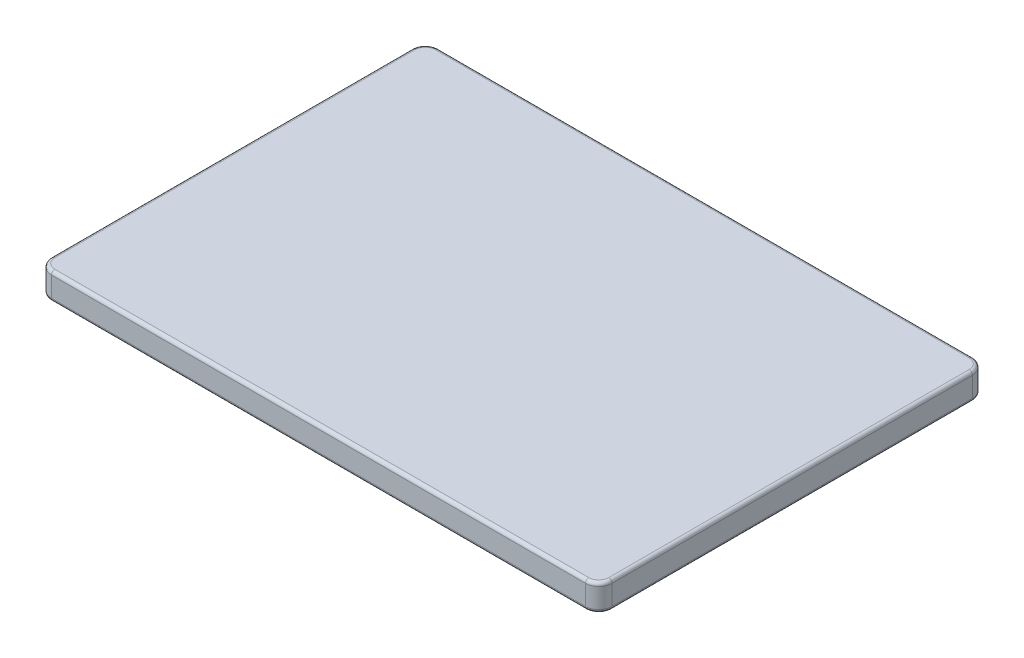
ISO-10303-21;
HEADER;
FILE_DESCRIPTION(('STEP AP214'),'2;1');
FILE_NAME('part.step','',(''),(''),'','','');
FILE_SCHEMA(('AUTOMOTIVE_DESIGN { 1 0 10303 214 1 1 1 1 }'));
ENDSEC;
DATA;
#1=APPLICATION_CONTEXT('core data for automotive mechanical design processes');
#2=APPLICATION_PROTOCOL_DEFINITION('international standard','automotive_design',2000,#1);
#3=PRODUCT_CONTEXT('',#1,'mechanical');
#4=PRODUCT('Part','Part','',(#3));
#5=PRODUCT_RELATED_PRODUCT_CATEGORY('part','',(#4));
#6=PRODUCT_DEFINITION_FORMATION('','',#4);
#7=PRODUCT_DEFINITION_CONTEXT('part definition',#1,'design');
#8=PRODUCT_DEFINITION('design','',#6,#7);
#9=PRODUCT_DEFINITION_SHAPE('','',#8);
#10=(LENGTH_UNIT() NAMED_UNIT(*) SI_UNIT(.MILLI.,.METRE.));
#11=(NAMED_UNIT(*) PLANE_ANGLE_UNIT() SI_UNIT($,.RADIAN.));
#12=(NAMED_UNIT(*) SI_UNIT($,.STERADIAN.) SOLID_ANGLE_UNIT());
#13=UNCERTAINTY_MEASURE_WITH_UNIT(LENGTH_MEASURE(1.E-05),#10,'distance_accuracy_value','');
#14=(GEOMETRIC_REPRESENTATION_CONTEXT(3) GLOBAL_UNCERTAINTY_ASSIGNED_CONTEXT((#13)) GLOBAL_UNIT_ASSIGNED_CONTEXT((#10,
#11,#12)) REPRESENTATION_CONTEXT('',''));
#15=CARTESIAN_POINT('',(0.,0.,0.));
#16=DIRECTION('',(0.,0.,1.));
#17=DIRECTION('',(1.,0.,0.));
#18=AXIS2_PLACEMENT_3D('',#15,#16,#17);
#19=CARTESIAN_POINT('',(210.,20.,145.));
#20=DIRECTION('',(-1.,0.,0.));
#21=DIRECTION('',(0.,0.,1.));
#22=AXIS2_PLACEMENT_3D('',#19,#20,#21);
#23=PLANE('',#22);
#24=DIRECTION('',(0.,0.,-1.));
#25=VECTOR('',#24,1.);
#26=CARTESIAN_POINT('',(210.,2.5,-145.));
#27=LINE('',#26,#25);
#28=CARTESIAN_POINT('',(210.,2.5,135.));
#29=VERTEX_POINT('',#28);
#30=CARTESIAN_POINT('',(210.,2.5,-135.));
#31=VERTEX_POINT('',#30);
#32=EDGE_CURVE('E44',#29,#31,#27,.T.);
#33=ORIENTED_EDGE('',*,*,#32,.T.);
#34=DIRECTION('',(0.,-1.,0.));
#35=VECTOR('',#34,1.);
#36=CARTESIAN_POINT('',(210.,20.,-135.));
#37=LINE('',#36,#35);
#38=CARTESIAN_POINT('',(210.,17.5,-135.));
#39=VERTEX_POINT('',#38);
#40=EDGE_CURVE('E12',#31,#39,#37,.F.);
#41=ORIENTED_EDGE('',*,*,#40,.T.);
#42=DIRECTION('',(0.,0.,-1.));
#43=VECTOR('',#42,1.);
#44=CARTESIAN_POINT('',(210.,17.5,145.));
#45=LINE('',#44,#43);
#46=CARTESIAN_POINT('',(210.,17.5,135.));
#47=VERTEX_POINT('',#46);
#48=EDGE_CURVE('E249',#39,#47,#45,.F.);
#49=ORIENTED_EDGE('',*,*,#48,.T.);
#50=DIRECTION('',(0.,-1.,0.));
#51=VECTOR('',#50,1.);
#52=CARTESIAN_POINT('',(210.,20.,135.));
#53=LINE('',#52,#51);
#54=EDGE_CURVE('E247',#47,#29,#53,.T.);
#55=ORIENTED_EDGE('',*,*,#54,.T.);
#56=EDGE_LOOP('',(#33,#41,#49,#55));
#57=FACE_BOUND('',#56,.T.);
#58=ADVANCED_FACE('F35',(#57),#23,.F.);
#59=CARTESIAN_POINT('',(-210.,20.,-145.));
#60=DIRECTION('',(0.,0.,1.));
#61=DIRECTION('',(1.,0.,0.));
#62=AXIS2_PLACEMENT_3D('',#59,#60,#61);
#63=PLANE('',#62);
#64=DIRECTION('',(-1.,0.,0.));
#65=VECTOR('',#64,1.);
#66=CARTESIAN_POINT('',(-210.,17.5,-145.));
#67=LINE('',#66,#65);
#68=CARTESIAN_POINT('',(-200.,17.5,-145.));
#69=VERTEX_POINT('',#68);
#70=CARTESIAN_POINT('',(200.,17.5,-145.));
#71=VERTEX_POINT('',#70);
#72=EDGE_CURVE('E240',#69,#71,#67,.F.);
#73=ORIENTED_EDGE('',*,*,#72,.T.);
#74=DIRECTION('',(0.,-1.,0.));
#75=VECTOR('',#74,1.);
#76=CARTESIAN_POINT('',(200.,20.,-145.));
#77=LINE('',#76,#75);
#78=CARTESIAN_POINT('',(200.,2.5,-145.));
#79=VERTEX_POINT('',#78);
#80=EDGE_CURVE('E245',#71,#79,#77,.T.);
#81=ORIENTED_EDGE('',*,*,#80,.T.);
#82=DIRECTION('',(-1.,0.,0.));
#83=VECTOR('',#82,1.);
#84=CARTESIAN_POINT('',(-210.,2.5,-145.));
#85=LINE('',#84,#83);
#86=CARTESIAN_POINT('',(-200.,2.5,-145.));
#87=VERTEX_POINT('',#86);
#88=EDGE_CURVE('E242',#79,#87,#85,.T.);
#89=ORIENTED_EDGE('',*,*,#88,.T.);
#90=DIRECTION('',(0.,-1.,0.));
#91=VECTOR('',#90,1.);
#92=CARTESIAN_POINT('',(-200.,20.,-145.));
#93=LINE('',#92,#91);
#94=EDGE_CURVE('E238',#87,#69,#93,.F.);
#95=ORIENTED_EDGE('',*,*,#94,.T.);
#96=EDGE_LOOP('',(#73,#81,#89,#95));
#97=FACE_BOUND('',#96,.T.);
#98=ADVANCED_FACE('F339',(#97),#63,.F.);
#99=CARTESIAN_POINT('',(-210.,20.,145.));
#100=DIRECTION('',(1.,0.,0.));
#101=DIRECTION('',(0.,0.,-1.));
#102=AXIS2_PLACEMENT_3D('',#99,#100,#101);
#103=PLANE('',#102);
#104=DIRECTION('',(0.,0.,1.));
#105=VECTOR('',#104,1.);
#106=CARTESIAN_POINT('',(-210.,17.5,145.));
#107=LINE('',#106,#105);
#108=CARTESIAN_POINT('',(-210.,17.5,135.));
#109=VERTEX_POINT('',#108);
#110=CARTESIAN_POINT('',(-210.,17.5,-135.));
#111=VERTEX_POINT('',#110);
#112=EDGE_CURVE('E231',#109,#111,#107,.F.);
#113=ORIENTED_EDGE('',*,*,#112,.T.);
#114=DIRECTION('',(0.,-1.,0.));
#115=VECTOR('',#114,1.);
#116=CARTESIAN_POINT('',(-210.,20.,-135.));
#117=LINE('',#116,#115);
#118=CARTESIAN_POINT('',(-210.,2.5,-135.));
#119=VERTEX_POINT('',#118);
#120=EDGE_CURVE('E236',#111,#119,#117,.T.);
#121=ORIENTED_EDGE('',*,*,#120,.T.);
#122=DIRECTION('',(0.,0.,1.));
#123=VECTOR('',#122,1.);
#124=CARTESIAN_POINT('',(-210.,2.5,145.));
#125=LINE('',#124,#123);
#126=CARTESIAN_POINT('',(-210.,2.5,135.));
#127=VERTEX_POINT('',#126);
#128=EDGE_CURVE('E233',#119,#127,#125,.T.);
#129=ORIENTED_EDGE('',*,*,#128,.T.);
#130=DIRECTION('',(0.,-1.,0.));
#131=VECTOR('',#130,1.);
#132=CARTESIAN_POINT('',(-210.,20.,135.));
#133=LINE('',#132,#131);
#134=EDGE_CURVE('E229',#127,#109,#133,.F.);
#135=ORIENTED_EDGE('',*,*,#134,.T.);
#136=EDGE_LOOP('',(#113,#121,#129,#135));
#137=FACE_BOUND('',#136,.T.);
#138=ADVANCED_FACE('F319',(#137),#103,.F.);
#139=CARTESIAN_POINT('',(-210.,20.,145.));
#140=DIRECTION('',(0.,0.,-1.));
#141=DIRECTION('',(-1.,0.,0.));
#142=AXIS2_PLACEMENT_3D('',#139,#140,#141);
#143=PLANE('',#142);
#144=DIRECTION('',(1.,0.,0.));
#145=VECTOR('',#144,1.);
#146=CARTESIAN_POINT('',(-210.,17.5,145.));
#147=LINE('',#146,#145);
#148=CARTESIAN_POINT('',(200.,17.5,145.));
#149=VERTEX_POINT('',#148);
#150=CARTESIAN_POINT('',(-200.,17.5,145.));
#151=VERTEX_POINT('',#150);
#152=EDGE_CURVE('E181',#149,#151,#147,.F.);
#153=ORIENTED_EDGE('',*,*,#152,.T.);
#154=DIRECTION('',(0.,-1.,0.));
#155=VECTOR('',#154,1.);
#156=CARTESIAN_POINT('',(-200.,20.,145.));
#157=LINE('',#156,#155);
#158=CARTESIAN_POINT('',(-200.,2.5,145.));
#159=VERTEX_POINT('',#158);
#160=EDGE_CURVE('E185',#151,#159,#157,.T.);
#161=ORIENTED_EDGE('',*,*,#160,.T.);
#162=DIRECTION('',(1.,0.,0.));
#163=VECTOR('',#162,1.);
#164=CARTESIAN_POINT('',(210.,2.5,145.));
#165=LINE('',#164,#163);
#166=CARTESIAN_POINT('',(200.,2.5,145.));
#167=VERTEX_POINT('',#166);
#168=EDGE_CURVE('E156',#159,#167,#165,.T.);
#169=ORIENTED_EDGE('',*,*,#168,.T.);
#170=DIRECTION('',(0.,-1.,0.));
#171=VECTOR('',#170,1.);
#172=CARTESIAN_POINT('',(200.,20.,145.));
#173=LINE('',#172,#171);
#174=EDGE_CURVE('E175',#167,#149,#173,.F.);
#175=ORIENTED_EDGE('',*,*,#174,.T.);
#176=EDGE_LOOP('',(#153,#161,#169,#175));
#177=FACE_BOUND('',#176,.T.);
#178=ADVANCED_FACE('F183',(#177),#143,.F.);
#179=CARTESIAN_POINT('',(0.,20.,0.));
#180=DIRECTION('',(0.,-1.,0.));
#181=DIRECTION('',(0.,0.,-1.));
#182=AXIS2_PLACEMENT_3D('',#179,#180,#181);
#183=PLANE('',#182);
#184=CARTESIAN_POINT('',(-200.,20.,-135.));
#185=DIRECTION('',(0.,-1.,0.));
#186=DIRECTION('',(0.,0.,-1.));
#187=AXIS2_PLACEMENT_3D('',#184,#185,#186);
#188=CIRCLE('',#187,7.5);
#189=CARTESIAN_POINT('',(-207.5,20.,-135.));
#190=VERTEX_POINT('',#189);
#191=CARTESIAN_POINT('',(-200.,20.,-142.5));
#192=VERTEX_POINT('',#191);
#193=EDGE_CURVE('E221',#190,#192,#188,.T.);
#194=ORIENTED_EDGE('',*,*,#193,.F.);
#195=DIRECTION('',(0.,0.,1.));
#196=VECTOR('',#195,1.);
#197=CARTESIAN_POINT('',(-207.5,20.,0.));
#198=LINE('',#197,#196);
#199=CARTESIAN_POINT('',(-207.5,20.,135.));
#200=VERTEX_POINT('',#199);
#201=EDGE_CURVE('E227',#190,#200,#198,.T.);
#202=ORIENTED_EDGE('',*,*,#201,.T.);
#203=CARTESIAN_POINT('',(-200.,20.,135.));
#204=DIRECTION('',(0.,-1.,0.));
#205=DIRECTION('',(0.,0.,-1.));
#206=AXIS2_PLACEMENT_3D('',#203,#204,#205);
#207=CIRCLE('',#206,7.5);
#208=CARTESIAN_POINT('',(-200.,20.,142.5));
#209=VERTEX_POINT('',#208);
#210=EDGE_CURVE('E224',#209,#200,#207,.T.);
#211=ORIENTED_EDGE('',*,*,#210,.F.);
#212=DIRECTION('',(1.,0.,0.));
#213=VECTOR('',#212,1.);
#214=CARTESIAN_POINT('',(0.,20.,142.5));
#215=LINE('',#214,#213);
#216=CARTESIAN_POINT('',(200.,20.,142.5));
#217=VERTEX_POINT('',#216);
#218=EDGE_CURVE('E218',#209,#217,#215,.T.);
#219=ORIENTED_EDGE('',*,*,#218,.T.);
#220=CARTESIAN_POINT('',(200.,20.,135.));
#221=DIRECTION('',(0.,-1.,0.));
#222=DIRECTION('',(0.,0.,-1.));
#223=AXIS2_PLACEMENT_3D('',#220,#221,#222);
#224=CIRCLE('',#223,7.5);
#225=CARTESIAN_POINT('',(207.5,20.,135.));
#226=VERTEX_POINT('',#225);
#227=EDGE_CURVE('E216',#226,#217,#224,.T.);
#228=ORIENTED_EDGE('',*,*,#227,.F.);
#229=DIRECTION('',(0.,0.,-1.));
#230=VECTOR('',#229,1.);
#231=CARTESIAN_POINT('',(207.5,20.,0.));
#232=LINE('',#231,#230);
#233=CARTESIAN_POINT('',(207.5,20.,-135.));
#234=VERTEX_POINT('',#233);
#235=EDGE_CURVE('E212',#226,#234,#232,.T.);
#236=ORIENTED_EDGE('',*,*,#235,.T.);
#237=CARTESIAN_POINT('',(200.,20.,-135.));
#238=DIRECTION('',(0.,-1.,0.));
#239=DIRECTION('',(0.,0.,-1.));
#240=AXIS2_PLACEMENT_3D('',#237,#238,#239);
#241=CIRCLE('',#240,7.5);
#242=CARTESIAN_POINT('',(200.,20.,-142.5));
#243=VERTEX_POINT('',#242);
#244=EDGE_CURVE('E209',#243,#234,#241,.T.);
#245=ORIENTED_EDGE('',*,*,#244,.F.);
#246=DIRECTION('',(-1.,0.,0.));
#247=VECTOR('',#246,1.);
#248=CARTESIAN_POINT('',(0.,20.,-142.5));
#249=LINE('',#248,#247);
#250=EDGE_CURVE('E214',#243,#192,#249,.T.);
#251=ORIENTED_EDGE('',*,*,#250,.T.);
#252=EDGE_LOOP('',(#194,#202,#211,#219,#228,#236,#245,#251));
#253=FACE_BOUND('',#252,.T.);
#254=ADVANCED_FACE('F328',(#253),#183,.F.);
#255=CARTESIAN_POINT('',(0.,0.,0.));
#256=DIRECTION('',(0.,-1.,0.));
#257=DIRECTION('',(0.,0.,-1.));
#258=AXIS2_PLACEMENT_3D('',#255,#256,#257);
#259=PLANE('',#258);
#260=CARTESIAN_POINT('',(200.,0.,135.));
#261=DIRECTION('',(0.,-1.,0.));
#262=DIRECTION('',(0.,0.,-1.));
#263=AXIS2_PLACEMENT_3D('',#260,#261,#262);
#264=CIRCLE('',#263,7.5);
#265=CARTESIAN_POINT('',(200.,0.,142.5));
#266=VERTEX_POINT('',#265);
#267=CARTESIAN_POINT('',(207.5,0.,135.));
#268=VERTEX_POINT('',#267);
#269=EDGE_CURVE('E188',#266,#268,#264,.F.);
#270=ORIENTED_EDGE('',*,*,#269,.F.);
#271=DIRECTION('',(1.,0.,0.));
#272=VECTOR('',#271,1.);
#273=CARTESIAN_POINT('',(-210.,0.,142.5));
#274=LINE('',#273,#272);
#275=CARTESIAN_POINT('',(-200.,0.,142.5));
#276=VERTEX_POINT('',#275);
#277=EDGE_CURVE('E158',#266,#276,#274,.F.);
#278=ORIENTED_EDGE('',*,*,#277,.T.);
#279=CARTESIAN_POINT('',(-200.,0.,135.));
#280=DIRECTION('',(0.,-1.,0.));
#281=DIRECTION('',(0.,0.,-1.));
#282=AXIS2_PLACEMENT_3D('',#279,#280,#281);
#283=CIRCLE('',#282,7.5);
#284=CARTESIAN_POINT('',(-207.5,0.,135.));
#285=VERTEX_POINT('',#284);
#286=EDGE_CURVE('E205',#285,#276,#283,.F.);
#287=ORIENTED_EDGE('',*,*,#286,.F.);
#288=DIRECTION('',(0.,0.,1.));
#289=VECTOR('',#288,1.);
#290=CARTESIAN_POINT('',(-207.5,0.,-145.));
#291=LINE('',#290,#289);
#292=CARTESIAN_POINT('',(-207.5,0.,-135.));
#293=VERTEX_POINT('',#292);
#294=EDGE_CURVE('E203',#285,#293,#291,.F.);
#295=ORIENTED_EDGE('',*,*,#294,.T.);
#296=CARTESIAN_POINT('',(-200.,0.,-135.));
#297=DIRECTION('',(0.,-1.,0.));
#298=DIRECTION('',(0.,0.,-1.));
#299=AXIS2_PLACEMENT_3D('',#296,#297,#298);
#300=CIRCLE('',#299,7.5);
#301=CARTESIAN_POINT('',(-200.,0.,-142.5));
#302=VERTEX_POINT('',#301);
#303=EDGE_CURVE('E200',#302,#293,#300,.F.);
#304=ORIENTED_EDGE('',*,*,#303,.F.);
#305=DIRECTION('',(-1.,0.,0.));
#306=VECTOR('',#305,1.);
#307=CARTESIAN_POINT('',(210.,0.,-142.5));
#308=LINE('',#307,#306);
#309=CARTESIAN_POINT('',(200.,0.,-142.5));
#310=VERTEX_POINT('',#309);
#311=EDGE_CURVE('E198',#302,#310,#308,.F.);
#312=ORIENTED_EDGE('',*,*,#311,.T.);
#313=CARTESIAN_POINT('',(200.,0.,-135.));
#314=DIRECTION('',(0.,-1.,0.));
#315=DIRECTION('',(0.,0.,-1.));
#316=AXIS2_PLACEMENT_3D('',#313,#314,#315);
#317=CIRCLE('',#316,7.5);
#318=CARTESIAN_POINT('',(207.5,0.,-135.));
#319=VERTEX_POINT('',#318);
#320=EDGE_CURVE('E195',#319,#310,#317,.F.);
#321=ORIENTED_EDGE('',*,*,#320,.F.);
#322=DIRECTION('',(0.,0.,-1.));
#323=VECTOR('',#322,1.);
#324=CARTESIAN_POINT('',(207.5,0.,145.));
#325=LINE('',#324,#323);
#326=EDGE_CURVE('E193',#319,#268,#325,.F.);
#327=ORIENTED_EDGE('',*,*,#326,.T.);
#328=EDGE_LOOP('',(#270,#278,#287,#295,#304,#312,#321,#327));
#329=FACE_BOUND('',#328,.T.);
#330=ADVANCED_FACE('F370',(#329),#259,.T.);
#331=CARTESIAN_POINT('',(0.,17.5,-142.5));
#332=DIRECTION('',(-1.,0.,0.));
#333=DIRECTION('',(0.,0.,1.));
#334=AXIS2_PLACEMENT_3D('',#331,#332,#333);
#335=CYLINDRICAL_SURFACE('',#334,2.5);
#336=CARTESIAN_POINT('',(-200.,17.5,-142.5));
#337=DIRECTION('',(-1.,0.,0.));
#338=DIRECTION('',(0.,0.,1.));
#339=AXIS2_PLACEMENT_3D('',#336,#337,#338);
#340=CIRCLE('',#339,2.5);
#341=EDGE_CURVE('E39',#192,#69,#340,.T.);
#342=ORIENTED_EDGE('',*,*,#341,.F.);
#343=ORIENTED_EDGE('',*,*,#250,.F.);
#344=CARTESIAN_POINT('',(200.,17.5,-142.5));
#345=DIRECTION('',(1.,0.,0.));
#346=DIRECTION('',(0.,0.,-1.));
#347=AXIS2_PLACEMENT_3D('',#344,#345,#346);
#348=CIRCLE('',#347,2.5);
#349=EDGE_CURVE('E298',#71,#243,#348,.T.);
#350=ORIENTED_EDGE('',*,*,#349,.F.);
#351=ORIENTED_EDGE('',*,*,#72,.F.);
#352=EDGE_LOOP('',(#342,#343,#350,#351));
#353=FACE_BOUND('',#352,.T.);
#354=ADVANCED_FACE('F37',(#353),#335,.T.);
#355=CARTESIAN_POINT('',(-200.,17.5,-135.));
#356=DIRECTION('',(0.,-1.,0.));
#357=DIRECTION('',(0.,0.,-1.));
#358=AXIS2_PLACEMENT_3D('',#355,#356,#357);
#359=TOROIDAL_SURFACE('',#358,7.5,2.5);
#360=ORIENTED_EDGE('',*,*,#193,.T.);
#361=ORIENTED_EDGE('',*,*,#341,.T.);
#362=CARTESIAN_POINT('',(-200.,17.5,-135.));
#363=DIRECTION('',(0.,-1.,0.));
#364=DIRECTION('',(0.,0.,-1.));
#365=AXIS2_PLACEMENT_3D('',#362,#363,#364);
#366=CIRCLE('',#365,10.);
#367=EDGE_CURVE('E296',#111,#69,#366,.T.);
#368=ORIENTED_EDGE('',*,*,#367,.F.);
#369=CARTESIAN_POINT('',(-207.5,17.5,-135.));
#370=DIRECTION('',(0.,0.,-1.));
#371=DIRECTION('',(-1.,0.,0.));
#372=AXIS2_PLACEMENT_3D('',#369,#370,#371);
#373=CIRCLE('',#372,2.5);
#374=EDGE_CURVE('E293',#190,#111,#373,.F.);
#375=ORIENTED_EDGE('',*,*,#374,.F.);
#376=EDGE_LOOP('',(#360,#361,#368,#375));
#377=FACE_BOUND('',#376,.T.);
#378=ADVANCED_FACE('F307',(#377),#359,.T.);
#379=CARTESIAN_POINT('',(200.,17.5,-135.));
#380=DIRECTION('',(0.,-1.,0.));
#381=DIRECTION('',(0.,0.,-1.));
#382=AXIS2_PLACEMENT_3D('',#379,#380,#381);
#383=TOROIDAL_SURFACE('',#382,7.5,2.5);
#384=ORIENTED_EDGE('',*,*,#349,.T.);
#385=ORIENTED_EDGE('',*,*,#244,.T.);
#386=CARTESIAN_POINT('',(207.5,17.5,-135.));
#387=DIRECTION('',(0.,0.,-1.));
#388=DIRECTION('',(-1.,0.,0.));
#389=AXIS2_PLACEMENT_3D('',#386,#387,#388);
#390=CIRCLE('',#389,2.5);
#391=EDGE_CURVE('E290',#39,#234,#390,.F.);
#392=ORIENTED_EDGE('',*,*,#391,.F.);
#393=CARTESIAN_POINT('',(200.,17.5,-135.));
#394=DIRECTION('',(0.,-1.,0.));
#395=DIRECTION('',(0.,0.,-1.));
#396=AXIS2_PLACEMENT_3D('',#393,#394,#395);
#397=CIRCLE('',#396,10.);
#398=EDGE_CURVE('E288',#71,#39,#397,.T.);
#399=ORIENTED_EDGE('',*,*,#398,.F.);
#400=EDGE_LOOP('',(#384,#385,#392,#399));
#401=FACE_BOUND('',#400,.T.);
#402=ADVANCED_FACE('F332',(#401),#383,.T.);
#403=CARTESIAN_POINT('',(-200.,20.,-135.));
#404=DIRECTION('',(0.,-1.,0.));
#405=DIRECTION('',(0.,0.,-1.));
#406=AXIS2_PLACEMENT_3D('',#403,#404,#405);
#407=CYLINDRICAL_SURFACE('',#406,10.);
#408=ORIENTED_EDGE('',*,*,#367,.T.);
#409=ORIENTED_EDGE('',*,*,#94,.F.);
#410=CARTESIAN_POINT('',(-200.,2.5,-135.));
#411=DIRECTION('',(0.,-1.,0.));
#412=DIRECTION('',(0.,0.,-1.));
#413=AXIS2_PLACEMENT_3D('',#410,#411,#412);
#414=CIRCLE('',#413,10.);
#415=EDGE_CURVE('E283',#119,#87,#414,.T.);
#416=ORIENTED_EDGE('',*,*,#415,.F.);
#417=ORIENTED_EDGE('',*,*,#120,.F.);
#418=EDGE_LOOP('',(#408,#409,#416,#417));
#419=FACE_BOUND('',#418,.T.);
#420=ADVANCED_FACE('F315',(#419),#407,.T.);
#421=CARTESIAN_POINT('',(-207.5,17.5,0.));
#422=DIRECTION('',(0.,0.,1.));
#423=DIRECTION('',(1.,0.,0.));
#424=AXIS2_PLACEMENT_3D('',#421,#422,#423);
#425=CYLINDRICAL_SURFACE('',#424,2.5);
#426=ORIENTED_EDGE('',*,*,#374,.T.);
#427=ORIENTED_EDGE('',*,*,#112,.F.);
#428=CARTESIAN_POINT('',(-207.5,17.5,135.));
#429=DIRECTION('',(0.,0.,1.));
#430=DIRECTION('',(1.,0.,0.));
#431=AXIS2_PLACEMENT_3D('',#428,#429,#430);
#432=CIRCLE('',#431,2.5);
#433=EDGE_CURVE('E280',#200,#109,#432,.T.);
#434=ORIENTED_EDGE('',*,*,#433,.F.);
#435=ORIENTED_EDGE('',*,*,#201,.F.);
#436=EDGE_LOOP('',(#426,#427,#434,#435));
#437=FACE_BOUND('',#436,.T.);
#438=ADVANCED_FACE('F326',(#437),#425,.T.);
#439=CARTESIAN_POINT('',(0.,17.5,142.5));
#440=DIRECTION('',(1.,0.,0.));
#441=DIRECTION('',(0.,0.,-1.));
#442=AXIS2_PLACEMENT_3D('',#439,#440,#441);
#443=CYLINDRICAL_SURFACE('',#442,2.5);
#444=CARTESIAN_POINT('',(200.,17.5,142.5));
#445=DIRECTION('',(1.,0.,0.));
#446=DIRECTION('',(0.,0.,-1.));
#447=AXIS2_PLACEMENT_3D('',#444,#445,#446);
#448=CIRCLE('',#447,2.5);
#449=EDGE_CURVE('E274',#217,#149,#448,.T.);
#450=ORIENTED_EDGE('',*,*,#449,.F.);
#451=ORIENTED_EDGE('',*,*,#218,.F.);
#452=CARTESIAN_POINT('',(-200.,17.5,142.5));
#453=DIRECTION('',(-1.,0.,0.));
#454=DIRECTION('',(0.,0.,1.));
#455=AXIS2_PLACEMENT_3D('',#452,#453,#454);
#456=CIRCLE('',#455,2.5);
#457=EDGE_CURVE('E277',#151,#209,#456,.T.);
#458=ORIENTED_EDGE('',*,*,#457,.F.);
#459=ORIENTED_EDGE('',*,*,#152,.F.);
#460=EDGE_LOOP('',(#450,#451,#458,#459));
#461=FACE_BOUND('',#460,.T.);
#462=ADVANCED_FACE('F361',(#461),#443,.T.);
#463=CARTESIAN_POINT('',(207.5,17.5,0.));
#464=DIRECTION('',(0.,0.,-1.));
#465=DIRECTION('',(-1.,0.,0.));
#466=AXIS2_PLACEMENT_3D('',#463,#464,#465);
#467=CYLINDRICAL_SURFACE('',#466,2.5);
#468=ORIENTED_EDGE('',*,*,#391,.T.);
#469=ORIENTED_EDGE('',*,*,#235,.F.);
#470=CARTESIAN_POINT('',(207.5,17.5,135.));
#471=DIRECTION('',(0.,0.,1.));
#472=DIRECTION('',(1.,0.,0.));
#473=AXIS2_PLACEMENT_3D('',#470,#471,#472);
#474=CIRCLE('',#473,2.5);
#475=EDGE_CURVE('E271',#47,#226,#474,.T.);
#476=ORIENTED_EDGE('',*,*,#475,.F.);
#477=ORIENTED_EDGE('',*,*,#48,.F.);
#478=EDGE_LOOP('',(#468,#469,#476,#477));
#479=FACE_BOUND('',#478,.T.);
#480=ADVANCED_FACE('F366',(#479),#467,.T.);
#481=CARTESIAN_POINT('',(200.,20.,-135.));
#482=DIRECTION('',(0.,-1.,0.));
#483=DIRECTION('',(0.,0.,-1.));
#484=AXIS2_PLACEMENT_3D('',#481,#482,#483);
#485=CYLINDRICAL_SURFACE('',#484,10.);
#486=ORIENTED_EDGE('',*,*,#398,.T.);
#487=ORIENTED_EDGE('',*,*,#40,.F.);
#488=CARTESIAN_POINT('',(200.,2.5,-135.));
#489=DIRECTION('',(0.,-1.,0.));
#490=DIRECTION('',(0.,0.,-1.));
#491=AXIS2_PLACEMENT_3D('',#488,#489,#490);
#492=CIRCLE('',#491,10.);
#493=EDGE_CURVE('E269',#79,#31,#492,.T.);
#494=ORIENTED_EDGE('',*,*,#493,.F.);
#495=ORIENTED_EDGE('',*,*,#80,.F.);
#496=EDGE_LOOP('',(#486,#487,#494,#495));
#497=FACE_BOUND('',#496,.T.);
#498=ADVANCED_FACE('F336',(#497),#485,.T.);
#499=CARTESIAN_POINT('',(-210.,2.5,-142.5));
#500=DIRECTION('',(1.,0.,0.));
#501=DIRECTION('',(0.,0.,-1.));
#502=AXIS2_PLACEMENT_3D('',#499,#500,#501);
#503=CYLINDRICAL_SURFACE('',#502,2.5);
#504=CARTESIAN_POINT('',(200.,2.5,-142.5));
#505=DIRECTION('',(1.,0.,0.));
#506=DIRECTION('',(0.,0.,-1.));
#507=AXIS2_PLACEMENT_3D('',#504,#505,#506);
#508=CIRCLE('',#507,2.5);
#509=EDGE_CURVE('E266',#310,#79,#508,.T.);
#510=ORIENTED_EDGE('',*,*,#509,.F.);
#511=ORIENTED_EDGE('',*,*,#311,.F.);
#512=CARTESIAN_POINT('',(-200.,2.5,-142.5));
#513=DIRECTION('',(-1.,0.,0.));
#514=DIRECTION('',(0.,0.,1.));
#515=AXIS2_PLACEMENT_3D('',#512,#513,#514);
#516=CIRCLE('',#515,2.5);
#517=EDGE_CURVE('E285',#87,#302,#516,.T.);
#518=ORIENTED_EDGE('',*,*,#517,.F.);
#519=ORIENTED_EDGE('',*,*,#88,.F.);
#520=EDGE_LOOP('',(#510,#511,#518,#519));
#521=FACE_BOUND('',#520,.T.);
#522=ADVANCED_FACE('F343',(#521),#503,.T.);
#523=CARTESIAN_POINT('',(-200.,2.5,-135.));
#524=DIRECTION('',(0.,-1.,0.));
#525=DIRECTION('',(0.,0.,-1.));
#526=AXIS2_PLACEMENT_3D('',#523,#524,#525);
#527=TOROIDAL_SURFACE('',#526,7.5,2.5);
#528=ORIENTED_EDGE('',*,*,#517,.T.);
#529=ORIENTED_EDGE('',*,*,#303,.T.);
#530=CARTESIAN_POINT('',(-207.5,2.5,-135.));
#531=DIRECTION('',(0.,0.,-1.));
#532=DIRECTION('',(-1.,0.,0.));
#533=AXIS2_PLACEMENT_3D('',#530,#531,#532);
#534=CIRCLE('',#533,2.5);
#535=EDGE_CURVE('E263',#119,#293,#534,.F.);
#536=ORIENTED_EDGE('',*,*,#535,.F.);
#537=ORIENTED_EDGE('',*,*,#415,.T.);
#538=EDGE_LOOP('',(#528,#529,#536,#537));
#539=FACE_BOUND('',#538,.T.);
#540=ADVANCED_FACE('F346',(#539),#527,.T.);
#541=CARTESIAN_POINT('',(-200.,17.5,135.));
#542=DIRECTION('',(0.,-1.,0.));
#543=DIRECTION('',(0.,0.,-1.));
#544=AXIS2_PLACEMENT_3D('',#541,#542,#543);
#545=TOROIDAL_SURFACE('',#544,7.5,2.5);
#546=ORIENTED_EDGE('',*,*,#210,.T.);
#547=ORIENTED_EDGE('',*,*,#433,.T.);
#548=CARTESIAN_POINT('',(-200.,17.5,135.));
#549=DIRECTION('',(0.,-1.,0.));
#550=DIRECTION('',(0.,0.,-1.));
#551=AXIS2_PLACEMENT_3D('',#548,#549,#550);
#552=CIRCLE('',#551,10.);
#553=EDGE_CURVE('E260',#151,#109,#552,.T.);
#554=ORIENTED_EDGE('',*,*,#553,.F.);
#555=ORIENTED_EDGE('',*,*,#457,.T.);
#556=EDGE_LOOP('',(#546,#547,#554,#555));
#557=FACE_BOUND('',#556,.T.);
#558=ADVANCED_FACE('F357',(#557),#545,.T.);
#559=CARTESIAN_POINT('',(200.,17.5,135.));
#560=DIRECTION('',(0.,-1.,0.));
#561=DIRECTION('',(0.,0.,-1.));
#562=AXIS2_PLACEMENT_3D('',#559,#560,#561);
#563=TOROIDAL_SURFACE('',#562,7.5,2.5);
#564=ORIENTED_EDGE('',*,*,#227,.T.);
#565=ORIENTED_EDGE('',*,*,#449,.T.);
#566=CARTESIAN_POINT('',(200.,17.5,135.));
#567=DIRECTION('',(0.,-1.,0.));
#568=DIRECTION('',(0.,0.,-1.));
#569=AXIS2_PLACEMENT_3D('',#566,#567,#568);
#570=CIRCLE('',#569,10.);
#571=EDGE_CURVE('E178',#47,#149,#570,.T.);
#572=ORIENTED_EDGE('',*,*,#571,.F.);
#573=ORIENTED_EDGE('',*,*,#475,.T.);
#574=EDGE_LOOP('',(#564,#565,#572,#573));
#575=FACE_BOUND('',#574,.T.);
#576=ADVANCED_FACE('F367',(#575),#563,.T.);
#577=CARTESIAN_POINT('',(200.,2.5,-135.));
#578=DIRECTION('',(0.,-1.,0.));
#579=DIRECTION('',(0.,0.,-1.));
#580=AXIS2_PLACEMENT_3D('',#577,#578,#579);
#581=TOROIDAL_SURFACE('',#580,7.5,2.5);
#582=ORIENTED_EDGE('',*,*,#509,.T.);
#583=ORIENTED_EDGE('',*,*,#493,.T.);
#584=CARTESIAN_POINT('',(207.5,2.5,-135.));
#585=DIRECTION('',(0.,0.,-1.));
#586=DIRECTION('',(-1.,0.,0.));
#587=AXIS2_PLACEMENT_3D('',#584,#585,#586);
#588=CIRCLE('',#587,2.5);
#589=EDGE_CURVE('E52',#319,#31,#588,.F.);
#590=ORIENTED_EDGE('',*,*,#589,.F.);
#591=ORIENTED_EDGE('',*,*,#320,.T.);
#592=EDGE_LOOP('',(#582,#583,#590,#591));
#593=FACE_BOUND('',#592,.T.);
#594=ADVANCED_FACE('F372',(#593),#581,.T.);
#595=CARTESIAN_POINT('',(-207.5,2.5,145.));
#596=DIRECTION('',(0.,0.,-1.));
#597=DIRECTION('',(-1.,0.,0.));
#598=AXIS2_PLACEMENT_3D('',#595,#596,#597);
#599=CYLINDRICAL_SURFACE('',#598,2.5);
#600=ORIENTED_EDGE('',*,*,#535,.T.);
#601=ORIENTED_EDGE('',*,*,#294,.F.);
#602=CARTESIAN_POINT('',(-207.5,2.5,135.));
#603=DIRECTION('',(0.,0.,1.));
#604=DIRECTION('',(1.,0.,0.));
#605=AXIS2_PLACEMENT_3D('',#602,#603,#604);
#606=CIRCLE('',#605,2.5);
#607=EDGE_CURVE('E255',#127,#285,#606,.T.);
#608=ORIENTED_EDGE('',*,*,#607,.F.);
#609=ORIENTED_EDGE('',*,*,#128,.F.);
#610=EDGE_LOOP('',(#600,#601,#608,#609));
#611=FACE_BOUND('',#610,.T.);
#612=ADVANCED_FACE('F350',(#611),#599,.T.);
#613=CARTESIAN_POINT('',(-200.,20.,135.));
#614=DIRECTION('',(0.,-1.,0.));
#615=DIRECTION('',(0.,0.,-1.));
#616=AXIS2_PLACEMENT_3D('',#613,#614,#615);
#617=CYLINDRICAL_SURFACE('',#616,10.);
#618=ORIENTED_EDGE('',*,*,#553,.T.);
#619=ORIENTED_EDGE('',*,*,#134,.F.);
#620=CARTESIAN_POINT('',(-200.,2.5,135.));
#621=DIRECTION('',(0.,-1.,0.));
#622=DIRECTION('',(0.,0.,-1.));
#623=AXIS2_PLACEMENT_3D('',#620,#621,#622);
#624=CIRCLE('',#623,10.);
#625=EDGE_CURVE('E172',#159,#127,#624,.T.);
#626=ORIENTED_EDGE('',*,*,#625,.F.);
#627=ORIENTED_EDGE('',*,*,#160,.F.);
#628=EDGE_LOOP('',(#618,#619,#626,#627));
#629=FACE_BOUND('',#628,.T.);
#630=ADVANCED_FACE('F353',(#629),#617,.T.);
#631=CARTESIAN_POINT('',(200.,20.,135.));
#632=DIRECTION('',(0.,-1.,0.));
#633=DIRECTION('',(0.,0.,-1.));
#634=AXIS2_PLACEMENT_3D('',#631,#632,#633);
#635=CYLINDRICAL_SURFACE('',#634,10.);
#636=ORIENTED_EDGE('',*,*,#571,.T.);
#637=ORIENTED_EDGE('',*,*,#174,.F.);
#638=CARTESIAN_POINT('',(200.,2.5,135.));
#639=DIRECTION('',(0.,-1.,0.));
#640=DIRECTION('',(0.,0.,-1.));
#641=AXIS2_PLACEMENT_3D('',#638,#639,#640);
#642=CIRCLE('',#641,10.);
#643=EDGE_CURVE('E165',#29,#167,#642,.T.);
#644=ORIENTED_EDGE('',*,*,#643,.F.);
#645=ORIENTED_EDGE('',*,*,#54,.F.);
#646=EDGE_LOOP('',(#636,#637,#644,#645));
#647=FACE_BOUND('',#646,.T.);
#648=ADVANCED_FACE('F176',(#647),#635,.T.);
#649=CARTESIAN_POINT('',(207.5,2.5,145.));
#650=DIRECTION('',(0.,0.,1.));
#651=DIRECTION('',(1.,0.,0.));
#652=AXIS2_PLACEMENT_3D('',#649,#650,#651);
#653=CYLINDRICAL_SURFACE('',#652,2.5);
#654=ORIENTED_EDGE('',*,*,#589,.T.);
#655=ORIENTED_EDGE('',*,*,#32,.F.);
#656=CARTESIAN_POINT('',(207.5,2.5,135.));
#657=DIRECTION('',(0.,0.,1.));
#658=DIRECTION('',(1.,0.,0.));
#659=AXIS2_PLACEMENT_3D('',#656,#657,#658);
#660=CIRCLE('',#659,2.5);
#661=EDGE_CURVE('E169',#268,#29,#660,.T.);
#662=ORIENTED_EDGE('',*,*,#661,.F.);
#663=ORIENTED_EDGE('',*,*,#326,.F.);
#664=EDGE_LOOP('',(#654,#655,#662,#663));
#665=FACE_BOUND('',#664,.T.);
#666=ADVANCED_FACE('F368',(#665),#653,.T.);
#667=CARTESIAN_POINT('',(-200.,2.5,135.));
#668=DIRECTION('',(0.,-1.,0.));
#669=DIRECTION('',(0.,0.,-1.));
#670=AXIS2_PLACEMENT_3D('',#667,#668,#669);
#671=TOROIDAL_SURFACE('',#670,7.5,2.5);
#672=ORIENTED_EDGE('',*,*,#607,.T.);
#673=ORIENTED_EDGE('',*,*,#286,.T.);
#674=CARTESIAN_POINT('',(-200.,2.5,142.5));
#675=DIRECTION('',(-1.,0.,0.));
#676=DIRECTION('',(0.,0.,1.));
#677=AXIS2_PLACEMENT_3D('',#674,#675,#676);
#678=CIRCLE('',#677,2.5);
#679=EDGE_CURVE('E161',#159,#276,#678,.F.);
#680=ORIENTED_EDGE('',*,*,#679,.F.);
#681=ORIENTED_EDGE('',*,*,#625,.T.);
#682=EDGE_LOOP('',(#672,#673,#680,#681));
#683=FACE_BOUND('',#682,.T.);
#684=ADVANCED_FACE('F393',(#683),#671,.T.);
#685=CARTESIAN_POINT('',(200.,2.5,135.));
#686=DIRECTION('',(0.,-1.,0.));
#687=DIRECTION('',(0.,0.,-1.));
#688=AXIS2_PLACEMENT_3D('',#685,#686,#687);
#689=TOROIDAL_SURFACE('',#688,7.5,2.5);
#690=ORIENTED_EDGE('',*,*,#661,.T.);
#691=ORIENTED_EDGE('',*,*,#643,.T.);
#692=CARTESIAN_POINT('',(200.,2.5,142.5));
#693=DIRECTION('',(1.,0.,0.));
#694=DIRECTION('',(0.,0.,-1.));
#695=AXIS2_PLACEMENT_3D('',#692,#693,#694);
#696=CIRCLE('',#695,2.5);
#697=EDGE_CURVE('E152',#266,#167,#696,.F.);
#698=ORIENTED_EDGE('',*,*,#697,.F.);
#699=ORIENTED_EDGE('',*,*,#269,.T.);
#700=EDGE_LOOP('',(#690,#691,#698,#699));
#701=FACE_BOUND('',#700,.T.);
#702=ADVANCED_FACE('F167',(#701),#689,.T.);
#703=CARTESIAN_POINT('',(-210.,2.5,142.5));
#704=DIRECTION('',(-1.,0.,0.));
#705=DIRECTION('',(0.,0.,1.));
#706=AXIS2_PLACEMENT_3D('',#703,#704,#705);
#707=CYLINDRICAL_SURFACE('',#706,2.5);
#708=ORIENTED_EDGE('',*,*,#679,.T.);
#709=ORIENTED_EDGE('',*,*,#277,.F.);
#710=ORIENTED_EDGE('',*,*,#697,.T.);
#711=ORIENTED_EDGE('',*,*,#168,.F.);
#712=EDGE_LOOP('',(#708,#709,#710,#711));
#713=FACE_BOUND('',#712,.T.);
#714=ADVANCED_FACE('F154',(#713),#707,.T.);
#715=CLOSED_SHELL('',(#58,#98,#138,#178,#254,#330,#354,#378,#402,#420,#438,#462,#480,#498,#522,
#540,#558,#576,#594,#612,#630,#648,#666,#684,#702,#714));
#716=MANIFOLD_SOLID_BREP('B2',#715);
#717=ADVANCED_BREP_SHAPE_REPRESENTATION('',(#18,#716),#14);
#718=SHAPE_DEFINITION_REPRESENTATION(#9,#717);
ENDSEC;
END-ISO-10303-21;
